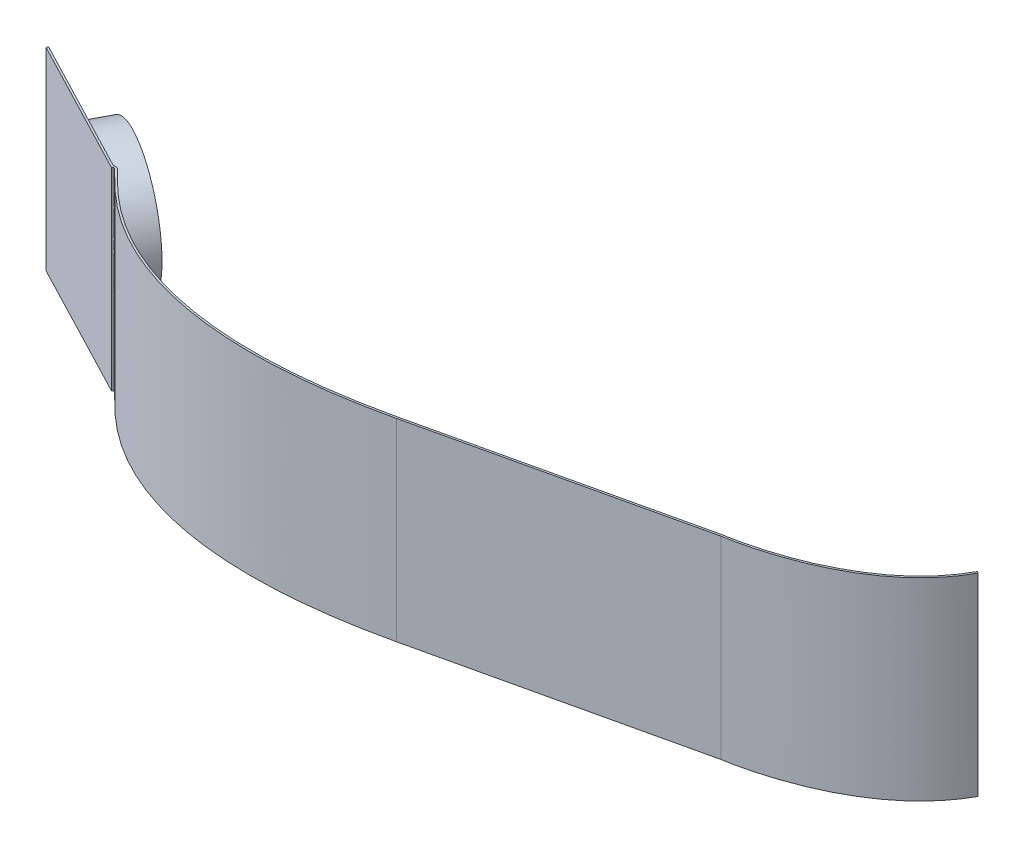
ISO-10303-21;
HEADER;
FILE_DESCRIPTION(('STEP AP214'),'2;1');
FILE_NAME('part.step','',(''),(''),'','','');
FILE_SCHEMA(('AUTOMOTIVE_DESIGN { 1 0 10303 214 1 1 1 1 }'));
ENDSEC;
DATA;
#1=APPLICATION_CONTEXT('core data for automotive mechanical design processes');
#2=APPLICATION_PROTOCOL_DEFINITION('international standard','automotive_design',2000,#1);
#3=PRODUCT_CONTEXT('',#1,'mechanical');
#4=PRODUCT('Part','Part','',(#3));
#5=PRODUCT_RELATED_PRODUCT_CATEGORY('part','',(#4));
#6=PRODUCT_DEFINITION_FORMATION('','',#4);
#7=PRODUCT_DEFINITION_CONTEXT('part definition',#1,'design');
#8=PRODUCT_DEFINITION('design','',#6,#7);
#9=PRODUCT_DEFINITION_SHAPE('','',#8);
#10=(LENGTH_UNIT() NAMED_UNIT(*) SI_UNIT(.MILLI.,.METRE.));
#11=(NAMED_UNIT(*) PLANE_ANGLE_UNIT() SI_UNIT($,.RADIAN.));
#12=(NAMED_UNIT(*) SI_UNIT($,.STERADIAN.) SOLID_ANGLE_UNIT());
#13=UNCERTAINTY_MEASURE_WITH_UNIT(LENGTH_MEASURE(1.E-05),#10,'distance_accuracy_value','');
#14=(GEOMETRIC_REPRESENTATION_CONTEXT(3) GLOBAL_UNCERTAINTY_ASSIGNED_CONTEXT((#13)) GLOBAL_UNIT_ASSIGNED_CONTEXT((#10,
#11,#12)) REPRESENTATION_CONTEXT('',''));
#15=CARTESIAN_POINT('',(0.,0.,0.));
#16=DIRECTION('',(0.,0.,1.));
#17=DIRECTION('',(1.,0.,0.));
#18=AXIS2_PLACEMENT_3D('',#15,#16,#17);
#19=CARTESIAN_POINT('',(-8.29560457956235,10.,4.98998225765585));
#20=CARTESIAN_POINT('',(-8.29545713337748,10.,4.98984712948497));
#21=CARTESIAN_POINT('',(-8.29530968719261,10.,4.98971200131408));
#22=CARTESIAN_POINT('',(-8.29516224100774,10.,4.98957687314319));
#23=CARTESIAN_POINT('',(-8.29161470599449,10.,4.98632570785932));
#24=CARTESIAN_POINT('',(-2.23861903735686,10.,4.15012337809756));
#25=CARTESIAN_POINT('',(0.,10.,0.));
#26=B_SPLINE_CURVE_WITH_KNOTS('',3,(#19,#20,#21,#22,#23,#24,#25),.UNSPECIFIED.,.F.,.F.,(4,3,4),
(-0.0410531683816529,0.000489483582096055,1.),.UNSPECIFIED.);
#27=DIRECTION('',(0.,-1.,0.));
#28=VECTOR('',#27,1.);
#29=SURFACE_OF_LINEAR_EXTRUSION('',#26,#28);
#30=CARTESIAN_POINT('',(-8.29516309928327,0.,4.9895810506514));
#31=CARTESIAN_POINT('',(-8.29754420674234,0.,4.98714392860338));
#32=CARTESIAN_POINT('',(-2.23971534124497,0.,4.15215579018716));
#33=CARTESIAN_POINT('',(0.,0.,0.));
#34=B_SPLINE_CURVE_WITH_KNOTS('',3,(#30,#31,#32,#33),.UNSPECIFIED.,.F.,.F.,(4,4),(0.,1.),.UNSPECIFIED.);
#35=CARTESIAN_POINT('',(-8.29516309928328,0.,4.9895810506514));
#36=VERTEX_POINT('',#35);
#37=CARTESIAN_POINT('',(0.,0.,0.));
#38=VERTEX_POINT('',#37);
#39=EDGE_CURVE('E219',#36,#38,#34,.T.);
#40=ORIENTED_EDGE('',*,*,#39,.T.);
#41=DIRECTION('',(0.,-1.,0.));
#42=VECTOR('',#41,1.);
#43=CARTESIAN_POINT('',(0.,10.,0.));
#44=LINE('',#43,#42);
#45=CARTESIAN_POINT('',(0.,10.,0.));
#46=VERTEX_POINT('',#45);
#47=EDGE_CURVE('E44',#46,#38,#44,.T.);
#48=ORIENTED_EDGE('',*,*,#47,.F.);
#49=CARTESIAN_POINT('',(-8.29516309928327,10.,4.9895810506514));
#50=CARTESIAN_POINT('',(-8.29754420674234,10.,4.98714392860338));
#51=CARTESIAN_POINT('',(-2.23971534124497,10.,4.15215579018716));
#52=CARTESIAN_POINT('',(0.,10.,0.));
#53=B_SPLINE_CURVE_WITH_KNOTS('',3,(#49,#50,#51,#52),.UNSPECIFIED.,.F.,.F.,(4,4),(0.,1.),.UNSPECIFIED.);
#54=CARTESIAN_POINT('',(-8.29516309928328,10.,4.9895810506514));
#55=VERTEX_POINT('',#54);
#56=EDGE_CURVE('E256',#55,#46,#53,.T.);
#57=ORIENTED_EDGE('',*,*,#56,.F.);
#58=DIRECTION('',(0.,-1.,0.));
#59=VECTOR('',#58,1.);
#60=CARTESIAN_POINT('',(-8.29516309928328,10.,4.9895810506514));
#61=LINE('',#60,#59);
#62=EDGE_CURVE('E141',#55,#36,#61,.T.);
#63=ORIENTED_EDGE('',*,*,#62,.T.);
#64=EDGE_LOOP('',(#40,#48,#57,#63));
#65=FACE_BOUND('',#64,.T.);
#66=ADVANCED_FACE('F35',(#65),#29,.F.);
#67=CARTESIAN_POINT('',(-0.0880122318935632,10.,-0.0474746989154609));
#68=DIRECTION('',(-0.474746989154609,0.,0.880122318935631));
#69=DIRECTION('',(0.880122318935631,0.,0.474746989154609));
#70=AXIS2_PLACEMENT_3D('',#67,#68,#69);
#71=PLANE('',#70);
#72=DIRECTION('',(-0.880122318935631,0.,-0.474746989154609));
#73=VECTOR('',#72,1.);
#74=CARTESIAN_POINT('',(-0.0880122318935632,0.,-0.0474746989154609));
#75=LINE('',#74,#73);
#76=CARTESIAN_POINT('',(-0.0880122318935632,0.,-0.0474746989154609));
#77=VERTEX_POINT('',#76);
#78=EDGE_CURVE('E215',#38,#77,#75,.T.);
#79=ORIENTED_EDGE('',*,*,#78,.T.);
#80=DIRECTION('',(0.,-1.,0.));
#81=VECTOR('',#80,1.);
#82=CARTESIAN_POINT('',(-0.0880122318935632,10.,-0.0474746989154609));
#83=LINE('',#82,#81);
#84=CARTESIAN_POINT('',(-0.0880122318935632,10.,-0.0474746989154609));
#85=VERTEX_POINT('',#84);
#86=EDGE_CURVE('E210',#85,#77,#83,.T.);
#87=ORIENTED_EDGE('',*,*,#86,.F.);
#88=DIRECTION('',(-0.880122318935631,0.,-0.474746989154609));
#89=VECTOR('',#88,1.);
#90=CARTESIAN_POINT('',(-0.0880122318935632,10.,-0.0474746989154609));
#91=LINE('',#90,#89);
#92=EDGE_CURVE('E102',#46,#85,#91,.T.);
#93=ORIENTED_EDGE('',*,*,#92,.F.);
#94=ORIENTED_EDGE('',*,*,#47,.T.);
#95=EDGE_LOOP('',(#79,#87,#93,#94));
#96=FACE_BOUND('',#95,.T.);
#97=ADVANCED_FACE('F214',(#96),#71,.F.);
#98=CARTESIAN_POINT('',(-0.0880122318935632,10.,-0.0474746989154609));
#99=CARTESIAN_POINT('',(-0.356397834565828,10.,0.450079081074757));
#100=CARTESIAN_POINT('',(-1.03283663303774,10.,1.38624218729705));
#101=CARTESIAN_POINT('',(-2.68336884966768,10.,2.85063794366895));
#102=CARTESIAN_POINT('',(-4.59765429097134,10.,3.83453828555857));
#103=CARTESIAN_POINT('',(-6.30837125209972,10.,4.43025386776187));
#104=CARTESIAN_POINT('',(-7.19732072237326,10.,4.66653576234868));
#105=CARTESIAN_POINT('',(-7.74428181641744,10.,4.78808191366238));
#106=CARTESIAN_POINT('',(-8.05390587119673,10.,4.84821590861223));
#107=CARTESIAN_POINT('',(-8.26562356691469,10.,4.88466973219331));
#108=CARTESIAN_POINT('',(-8.2895299353271,10.,4.8861388861817));
#109=CARTESIAN_POINT('',(-8.31576816498306,10.,4.89171231489404));
#110=B_SPLINE_CURVE_WITH_KNOTS('',3,(#98,#99,#100,#101,#102,#103,#104,#105,#106,#107,#108,#109),
.UNSPECIFIED.,.F.,.F.,(4,1,1,1,1,1,1,1,1,4),(0.,0.124588700608126,0.249177401216251,
0.498354802432503,0.622943503040628,0.747532203648754,0.809826553952817,0.87212090425688,
0.934415254560942,0.996709604865005),.UNSPECIFIED.);
#111=DIRECTION('',(0.,-1.,0.));
#112=VECTOR('',#111,1.);
#113=SURFACE_OF_LINEAR_EXTRUSION('',#110,#112);
#114=CARTESIAN_POINT('',(-0.0880122318935632,0.,-0.0474746989154609));
#115=CARTESIAN_POINT('',(-0.356397834565828,0.,0.450079081074757));
#116=CARTESIAN_POINT('',(-1.03283663303774,0.,1.38624218729705));
#117=CARTESIAN_POINT('',(-2.68336884966768,0.,2.85063794366895));
#118=CARTESIAN_POINT('',(-4.59765429097134,0.,3.83453828555857));
#119=CARTESIAN_POINT('',(-6.30837125209972,0.,4.43025386776187));
#120=CARTESIAN_POINT('',(-7.19732072237326,0.,4.66653576234868));
#121=CARTESIAN_POINT('',(-7.74428181641744,0.,4.78808191366238));
#122=CARTESIAN_POINT('',(-8.05390587119673,0.,4.84821590861223));
#123=CARTESIAN_POINT('',(-8.26562356691469,0.,4.88466973219331));
#124=CARTESIAN_POINT('',(-8.2895299353271,0.,4.8861388861817));
#125=CARTESIAN_POINT('',(-8.31576816498306,0.,4.89171231489404));
#126=B_SPLINE_CURVE_WITH_KNOTS('',3,(#114,#115,#116,#117,#118,#119,#120,#121,#122,#123,#124,
#125),.UNSPECIFIED.,.F.,.F.,(4,1,1,1,1,1,1,1,1,4),(0.,0.124588700608126,0.249177401216251,
0.498354802432503,0.622943503040628,0.747532203648754,0.809826553952817,0.87212090425688,
0.934415254560942,0.996709604865005),.UNSPECIFIED.);
#127=CARTESIAN_POINT('',(-8.31576816498306,0.,4.89171231489404));
#128=VERTEX_POINT('',#127);
#129=EDGE_CURVE('E222',#77,#128,#126,.T.);
#130=ORIENTED_EDGE('',*,*,#129,.T.);
#131=DIRECTION('',(0.,-1.,0.));
#132=VECTOR('',#131,1.);
#133=CARTESIAN_POINT('',(-8.31576816498306,10.,4.89171231489404));
#134=LINE('',#133,#132);
#135=CARTESIAN_POINT('',(-8.31576816498306,10.,4.89171231489404));
#136=VERTEX_POINT('',#135);
#137=EDGE_CURVE('E207',#136,#128,#134,.T.);
#138=ORIENTED_EDGE('',*,*,#137,.F.);
#139=EDGE_CURVE('E275',#85,#136,#110,.T.);
#140=ORIENTED_EDGE('',*,*,#139,.F.);
#141=ORIENTED_EDGE('',*,*,#86,.T.);
#142=EDGE_LOOP('',(#130,#138,#140,#141));
#143=FACE_BOUND('',#142,.T.);
#144=ADVANCED_FACE('F274',(#143),#113,.F.);
#145=CARTESIAN_POINT('',(-8.31576816498306,10.,4.89171231489404));
#146=DIRECTION('',(0.222533797801789,0.,0.97492497600375));
#147=DIRECTION('',(0.97492497600375,0.,-0.222533797801789));
#148=AXIS2_PLACEMENT_3D('',#145,#146,#147);
#149=PLANE('',#148);
#150=DIRECTION('',(-0.97492497600375,0.,0.222533797801789));
#151=VECTOR('',#150,1.);
#152=CARTESIAN_POINT('',(-8.31576816498306,0.,4.89171231489404));
#153=LINE('',#152,#151);
#154=CARTESIAN_POINT('',(-21.9663661468712,0.,8.00756172479092));
#155=VERTEX_POINT('',#154);
#156=EDGE_CURVE('E235',#128,#155,#153,.T.);
#157=ORIENTED_EDGE('',*,*,#156,.T.);
#158=DIRECTION('',(0.,-1.,0.));
#159=VECTOR('',#158,1.);
#160=CARTESIAN_POINT('',(-21.9663661468712,10.,8.00756172479092));
#161=LINE('',#160,#159);
#162=CARTESIAN_POINT('',(-21.9663661468712,10.,8.00756172479092));
#163=VERTEX_POINT('',#162);
#164=EDGE_CURVE('E204',#163,#155,#161,.T.);
#165=ORIENTED_EDGE('',*,*,#164,.F.);
#166=DIRECTION('',(-0.97492497600375,0.,0.222533797801789));
#167=VECTOR('',#166,1.);
#168=CARTESIAN_POINT('',(-8.31576816498306,10.,4.89171231489404));
#169=LINE('',#168,#167);
#170=EDGE_CURVE('E181',#136,#163,#169,.T.);
#171=ORIENTED_EDGE('',*,*,#170,.F.);
#172=ORIENTED_EDGE('',*,*,#137,.T.);
#173=EDGE_LOOP('',(#157,#165,#171,#172));
#174=FACE_BOUND('',#173,.T.);
#175=ADVANCED_FACE('F171',(#174),#149,.F.);
#176=CARTESIAN_POINT('',(-21.9663661468712,10.,8.00756172479092));
#177=CARTESIAN_POINT('',(-22.3960669978813,10.,8.10564410517753));
#178=CARTESIAN_POINT('',(-23.2752860644075,10.,8.29008635546012));
#179=CARTESIAN_POINT('',(-24.9149877928151,10.,8.57102420603637));
#180=CARTESIAN_POINT('',(-26.8367626846677,10.,8.78669269595092));
#181=CARTESIAN_POINT('',(-28.918808138399,10.,8.84906727757258));
#182=CARTESIAN_POINT('',(-31.4188160982728,10.,8.70858396765882));
#183=CARTESIAN_POINT('',(-34.0450772693976,10.,8.17987224980425));
#184=CARTESIAN_POINT('',(-36.4759145146865,10.,7.19521464773917));
#185=CARTESIAN_POINT('',(-38.2616059932859,10.,6.07352318362928));
#186=CARTESIAN_POINT('',(-39.2738773773643,10.,5.20122166650229));
#187=CARTESIAN_POINT('',(-39.837186402227,10.,4.64714178955607));
#188=CARTESIAN_POINT('',(-40.1432194738164,10.,4.32666542768816));
#189=CARTESIAN_POINT('',(-40.3232214156233,10.,4.16584933741384));
#190=CARTESIAN_POINT('',(-40.4156988848526,10.,4.08647725185921));
#191=CARTESIAN_POINT('',(-40.5362379636096,10.,4.08697907608015));
#192=CARTESIAN_POINT('',(-40.572148999079,10.,4.11641598314651));
#193=B_SPLINE_CURVE_WITH_KNOTS('',3,(#176,#177,#178,#179,#180,#181,#182,#183,#184,#185,#186,
#187,#188,#189,#190,#191,#192),.UNSPECIFIED.,.F.,.F.,(4,1,1,1,1,1,1,1,1,1,1,1,1,1,4),(0.,
0.0301794897446242,0.0603589794892484,0.120717958978497,0.181076938467745,0.241435917956994,
0.36215387693549,0.482871835913987,0.603589794892484,0.724307753870981,0.784666733360229,
0.845025712849478,0.905384692338726,0.93556418208335,0.965743671827974),.UNSPECIFIED.);
#194=DIRECTION('',(0.,-1.,0.));
#195=VECTOR('',#194,1.);
#196=SURFACE_OF_LINEAR_EXTRUSION('',#193,#195);
#197=CARTESIAN_POINT('',(-21.9663661468712,0.,8.00756172479092));
#198=CARTESIAN_POINT('',(-22.3960669978813,0.,8.10564410517753));
#199=CARTESIAN_POINT('',(-23.2752860644075,0.,8.29008635546012));
#200=CARTESIAN_POINT('',(-24.9149877928151,0.,8.57102420603637));
#201=CARTESIAN_POINT('',(-26.8367626846677,0.,8.78669269595092));
#202=CARTESIAN_POINT('',(-28.918808138399,0.,8.84906727757258));
#203=CARTESIAN_POINT('',(-31.4188160982728,0.,8.70858396765882));
#204=CARTESIAN_POINT('',(-34.0450772693976,0.,8.17987224980425));
#205=CARTESIAN_POINT('',(-36.4759145146865,0.,7.19521464773917));
#206=CARTESIAN_POINT('',(-38.2616059932859,0.,6.07352318362928));
#207=CARTESIAN_POINT('',(-39.2738773773643,0.,5.20122166650229));
#208=CARTESIAN_POINT('',(-39.837186402227,0.,4.64714178955607));
#209=CARTESIAN_POINT('',(-40.1432194738164,0.,4.32666542768816));
#210=CARTESIAN_POINT('',(-40.3232214156233,0.,4.16584933741384));
#211=CARTESIAN_POINT('',(-40.4156988848526,0.,4.08647725185921));
#212=CARTESIAN_POINT('',(-40.5362379636096,0.,4.08697907608015));
#213=CARTESIAN_POINT('',(-40.572148999079,0.,4.11641598314651));
#214=B_SPLINE_CURVE_WITH_KNOTS('',3,(#197,#198,#199,#200,#201,#202,#203,#204,#205,#206,#207,
#208,#209,#210,#211,#212,#213),.UNSPECIFIED.,.F.,.F.,(4,1,1,1,1,1,1,1,1,1,1,1,1,1,4),(0.,
0.0301794897446242,0.0603589794892484,0.120717958978497,0.181076938467745,0.241435917956994,
0.36215387693549,0.482871835913987,0.603589794892484,0.724307753870981,0.784666733360229,
0.845025712849478,0.905384692338726,0.93556418208335,0.965743671827974),.UNSPECIFIED.);
#215=CARTESIAN_POINT('',(-40.572148999079,0.,4.11641598314651));
#216=VERTEX_POINT('',#215);
#217=EDGE_CURVE('E240',#155,#216,#214,.T.);
#218=ORIENTED_EDGE('',*,*,#217,.T.);
#219=DIRECTION('',(0.,-1.,0.));
#220=VECTOR('',#219,1.);
#221=CARTESIAN_POINT('',(-40.572148999079,10.,4.11641598314651));
#222=LINE('',#221,#220);
#223=CARTESIAN_POINT('',(-40.572148999079,10.,4.11641598314651));
#224=VERTEX_POINT('',#223);
#225=EDGE_CURVE('E197',#224,#216,#222,.T.);
#226=ORIENTED_EDGE('',*,*,#225,.F.);
#227=EDGE_CURVE('E174',#163,#224,#193,.T.);
#228=ORIENTED_EDGE('',*,*,#227,.F.);
#229=ORIENTED_EDGE('',*,*,#164,.T.);
#230=EDGE_LOOP('',(#218,#226,#228,#229));
#231=FACE_BOUND('',#230,.T.);
#232=ADVANCED_FACE('F166',(#231),#196,.F.);
#233=CARTESIAN_POINT('',(-40.572148999079,10.,4.11641598314651));
#234=DIRECTION('',(-0.462246713202128,0.,0.886751360942756));
#235=DIRECTION('',(0.886751360942756,0.,0.462246713202128));
#236=AXIS2_PLACEMENT_3D('',#233,#234,#235);
#237=PLANE('',#236);
#238=CARTESIAN_POINT('',(-44.074518326861,5.,2.29069709339377));
#239=DIRECTION('',(-0.462246713202128,0.,0.886751360942756));
#240=DIRECTION('',(0.886751360942756,0.,0.462246713202128));
#241=AXIS2_PLACEMENT_3D('',#238,#239,#240);
#242=CIRCLE('',#241,3.49999999999999);
#243=CARTESIAN_POINT('',(-40.9708885635613,5.,3.90856058960121));
#244=VERTEX_POINT('',#243);
#245=EDGE_CURVE('E11',#244,#244,#242,.F.);
#246=ORIENTED_EDGE('',*,*,#245,.F.);
#247=EDGE_LOOP('',(#246));
#248=FACE_BOUND('',#247,.T.);
#249=DIRECTION('',(-0.886751360942756,0.,-0.462246713202128));
#250=VECTOR('',#249,1.);
#251=CARTESIAN_POINT('',(-40.572148999079,0.,4.11641598314651));
#252=LINE('',#251,#250);
#253=CARTESIAN_POINT('',(-47.5768876546429,0.,0.464978203641024));
#254=VERTEX_POINT('',#253);
#255=EDGE_CURVE('E195',#216,#254,#252,.T.);
#256=ORIENTED_EDGE('',*,*,#255,.T.);
#257=DIRECTION('',(0.,-1.,0.));
#258=VECTOR('',#257,1.);
#259=CARTESIAN_POINT('',(-47.5768876546429,10.,0.464978203641024));
#260=LINE('',#259,#258);
#261=CARTESIAN_POINT('',(-47.5768876546429,10.,0.464978203641024));
#262=VERTEX_POINT('',#261);
#263=EDGE_CURVE('E193',#262,#254,#260,.T.);
#264=ORIENTED_EDGE('',*,*,#263,.F.);
#265=DIRECTION('',(-0.886751360942756,0.,-0.462246713202128));
#266=VECTOR('',#265,1.);
#267=CARTESIAN_POINT('',(-40.572148999079,10.,4.11641598314651));
#268=LINE('',#267,#266);
#269=EDGE_CURVE('E180',#224,#262,#268,.T.);
#270=ORIENTED_EDGE('',*,*,#269,.F.);
#271=ORIENTED_EDGE('',*,*,#225,.T.);
#272=EDGE_LOOP('',(#256,#264,#270,#271));
#273=FACE_BOUND('',#272,.T.);
#274=ADVANCED_FACE('F162',(#248,#273),#237,.F.);
#275=CARTESIAN_POINT('',(-47.5768876546429,10.,0.464978203641024));
#276=DIRECTION('',(0.886751360942765,0.,0.46224671320211));
#277=DIRECTION('',(0.46224671320211,0.,-0.886751360942765));
#278=AXIS2_PLACEMENT_3D('',#275,#276,#277);
#279=PLANE('',#278);
#280=DIRECTION('',(-0.46224671320211,0.,0.886751360942765));
#281=VECTOR('',#280,1.);
#282=CARTESIAN_POINT('',(-47.5768876546429,0.,0.464978203641024));
#283=LINE('',#282,#281);
#284=CARTESIAN_POINT('',(-47.6231123259631,0.,0.553653339735303));
#285=VERTEX_POINT('',#284);
#286=EDGE_CURVE('E199',#254,#285,#283,.T.);
#287=ORIENTED_EDGE('',*,*,#286,.T.);
#288=DIRECTION('',(0.,-1.,0.));
#289=VECTOR('',#288,1.);
#290=CARTESIAN_POINT('',(-47.6231123259631,10.,0.553653339735303));
#291=LINE('',#290,#289);
#292=CARTESIAN_POINT('',(-47.6231123259631,10.,0.553653339735303));
#293=VERTEX_POINT('',#292);
#294=EDGE_CURVE('E136',#293,#285,#291,.T.);
#295=ORIENTED_EDGE('',*,*,#294,.F.);
#296=DIRECTION('',(-0.46224671320211,0.,0.886751360942765));
#297=VECTOR('',#296,1.);
#298=CARTESIAN_POINT('',(-47.5768876546429,10.,0.464978203641024));
#299=LINE('',#298,#297);
#300=EDGE_CURVE('E127',#262,#293,#299,.T.);
#301=ORIENTED_EDGE('',*,*,#300,.F.);
#302=ORIENTED_EDGE('',*,*,#263,.T.);
#303=EDGE_LOOP('',(#287,#295,#301,#302));
#304=FACE_BOUND('',#303,.T.);
#305=ADVANCED_FACE('F159',(#304),#279,.F.);
#306=CARTESIAN_POINT('',(-40.5291014384211,10.,4.25162704535232));
#307=DIRECTION('',(0.462246713202127,0.,-0.886751360942756));
#308=DIRECTION('',(-0.886751360942756,0.,-0.462246713202127));
#309=AXIS2_PLACEMENT_3D('',#306,#307,#308);
#310=PLANE('',#309);
#311=DIRECTION('',(0.886751360942756,0.,0.462246713202127));
#312=VECTOR('',#311,1.);
#313=CARTESIAN_POINT('',(-40.5291014384211,0.,4.25162704535232));
#314=LINE('',#313,#312);
#315=CARTESIAN_POINT('',(-40.5291014384211,0.,4.25162704535232));
#316=VERTEX_POINT('',#315);
#317=EDGE_CURVE('E135',#285,#316,#314,.T.);
#318=ORIENTED_EDGE('',*,*,#317,.T.);
#319=DIRECTION('',(0.,-1.,0.));
#320=VECTOR('',#319,1.);
#321=CARTESIAN_POINT('',(-40.5291014384211,10.,4.25162704535232));
#322=LINE('',#321,#320);
#323=CARTESIAN_POINT('',(-40.5291014384211,10.,4.25162704535232));
#324=VERTEX_POINT('',#323);
#325=EDGE_CURVE('E132',#324,#316,#322,.T.);
#326=ORIENTED_EDGE('',*,*,#325,.F.);
#327=DIRECTION('',(0.886751360942756,0.,0.462246713202127));
#328=VECTOR('',#327,1.);
#329=CARTESIAN_POINT('',(-40.5291014384211,10.,4.25162704535232));
#330=LINE('',#329,#328);
#331=EDGE_CURVE('E121',#293,#324,#330,.T.);
#332=ORIENTED_EDGE('',*,*,#331,.F.);
#333=ORIENTED_EDGE('',*,*,#294,.T.);
#334=EDGE_LOOP('',(#318,#326,#332,#333));
#335=FACE_BOUND('',#334,.T.);
#336=ADVANCED_FACE('F133',(#335),#310,.F.);
#337=CARTESIAN_POINT('',(-40.5291014384211,10.,4.25162704535233));
#338=CARTESIAN_POINT('',(-40.4640021809731,10.,3.39086402880593));
#339=CARTESIAN_POINT('',(-36.5993986089261,10.,11.4502310290803));
#340=CARTESIAN_POINT('',(-21.9441127670798,10.,8.10505422238872));
#341=B_SPLINE_CURVE_WITH_KNOTS('',3,(#337,#338,#339,#340),.UNSPECIFIED.,.F.,.F.,(4,4),(0.,1.),.UNSPECIFIED.);
#342=DIRECTION('',(0.,-1.,0.));
#343=VECTOR('',#342,1.);
#344=SURFACE_OF_LINEAR_EXTRUSION('',#341,#343);
#345=CARTESIAN_POINT('',(-40.5291014384211,0.,4.25162704535233));
#346=CARTESIAN_POINT('',(-40.4640021809731,0.,3.39086402880593));
#347=CARTESIAN_POINT('',(-36.5993986089261,0.,11.4502310290803));
#348=CARTESIAN_POINT('',(-21.9441127670798,0.,8.10505422238872));
#349=B_SPLINE_CURVE_WITH_KNOTS('',3,(#345,#346,#347,#348),.UNSPECIFIED.,.F.,.F.,(4,4),(0.,1.),.UNSPECIFIED.);
#350=CARTESIAN_POINT('',(-21.9441127670798,0.,8.10505422238872));
#351=VERTEX_POINT('',#350);
#352=EDGE_CURVE('E87',#316,#351,#349,.T.);
#353=ORIENTED_EDGE('',*,*,#352,.T.);
#354=DIRECTION('',(0.,-1.,0.));
#355=VECTOR('',#354,1.);
#356=CARTESIAN_POINT('',(-21.9441127670798,10.,8.10505422238872));
#357=LINE('',#356,#355);
#358=CARTESIAN_POINT('',(-21.9441127670798,10.,8.10505422238872));
#359=VERTEX_POINT('',#358);
#360=EDGE_CURVE('E137',#359,#351,#357,.T.);
#361=ORIENTED_EDGE('',*,*,#360,.F.);
#362=EDGE_CURVE('E125',#324,#359,#341,.T.);
#363=ORIENTED_EDGE('',*,*,#362,.F.);
#364=ORIENTED_EDGE('',*,*,#325,.T.);
#365=EDGE_LOOP('',(#353,#361,#363,#364));
#366=FACE_BOUND('',#365,.T.);
#367=ADVANCED_FACE('F139',(#366),#344,.F.);
#368=CARTESIAN_POINT('',(-8.29516309928328,10.,4.9895810506514));
#369=DIRECTION('',(-0.22253379791433,0.,-0.974924975978061));
#370=DIRECTION('',(-0.974924975978062,0.,0.22253379791433));
#371=AXIS2_PLACEMENT_3D('',#368,#369,#370);
#372=PLANE('',#371);
#373=DIRECTION('',(0.974924975978061,0.,-0.22253379791433));
#374=VECTOR('',#373,1.);
#375=CARTESIAN_POINT('',(-8.29516309928328,0.,4.9895810506514));
#376=LINE('',#375,#374);
#377=EDGE_CURVE('E93',#351,#36,#376,.T.);
#378=ORIENTED_EDGE('',*,*,#377,.T.);
#379=ORIENTED_EDGE('',*,*,#62,.F.);
#380=DIRECTION('',(0.974924975978061,0.,-0.22253379791433));
#381=VECTOR('',#380,1.);
#382=CARTESIAN_POINT('',(-8.29516309928328,10.,4.9895810506514));
#383=LINE('',#382,#381);
#384=EDGE_CURVE('E52',#359,#55,#383,.T.);
#385=ORIENTED_EDGE('',*,*,#384,.F.);
#386=ORIENTED_EDGE('',*,*,#360,.T.);
#387=EDGE_LOOP('',(#378,#379,#385,#386));
#388=FACE_BOUND('',#387,.T.);
#389=ADVANCED_FACE('F155',(#388),#372,.F.);
#390=CARTESIAN_POINT('',(-4.98836771790565,10.,4.05093502587788));
#391=DIRECTION('',(0.,1.,0.));
#392=DIRECTION('',(0.,0.,1.));
#393=AXIS2_PLACEMENT_3D('',#390,#391,#392);
#394=PLANE('',#393);
#395=ORIENTED_EDGE('',*,*,#56,.T.);
#396=ORIENTED_EDGE('',*,*,#92,.T.);
#397=ORIENTED_EDGE('',*,*,#139,.T.);
#398=ORIENTED_EDGE('',*,*,#170,.T.);
#399=ORIENTED_EDGE('',*,*,#227,.T.);
#400=ORIENTED_EDGE('',*,*,#269,.T.);
#401=ORIENTED_EDGE('',*,*,#300,.T.);
#402=ORIENTED_EDGE('',*,*,#331,.T.);
#403=ORIENTED_EDGE('',*,*,#362,.T.);
#404=ORIENTED_EDGE('',*,*,#384,.T.);
#405=EDGE_LOOP('',(#395,#396,#397,#398,#399,#400,#401,#402,#403,#404));
#406=FACE_BOUND('',#405,.T.);
#407=ADVANCED_FACE('F123',(#406),#394,.T.);
#408=CARTESIAN_POINT('',(-4.98836771790565,0.,4.05093502587788));
#409=DIRECTION('',(0.,1.,0.));
#410=DIRECTION('',(0.,0.,1.));
#411=AXIS2_PLACEMENT_3D('',#408,#409,#410);
#412=PLANE('',#411);
#413=ORIENTED_EDGE('',*,*,#39,.F.);
#414=ORIENTED_EDGE('',*,*,#377,.F.);
#415=ORIENTED_EDGE('',*,*,#352,.F.);
#416=ORIENTED_EDGE('',*,*,#317,.F.);
#417=ORIENTED_EDGE('',*,*,#286,.F.);
#418=ORIENTED_EDGE('',*,*,#255,.F.);
#419=ORIENTED_EDGE('',*,*,#217,.F.);
#420=ORIENTED_EDGE('',*,*,#156,.F.);
#421=ORIENTED_EDGE('',*,*,#129,.F.);
#422=ORIENTED_EDGE('',*,*,#78,.F.);
#423=EDGE_LOOP('',(#413,#414,#415,#416,#417,#418,#419,#420,#421,#422));
#424=FACE_BOUND('',#423,.T.);
#425=ADVANCED_FACE('F264',(#424),#412,.F.);
#426=CARTESIAN_POINT('',(-43.1500249004567,5.,0.517194371508268));
#427=DIRECTION('',(-0.462246713202128,0.,0.886751360942756));
#428=DIRECTION('',(0.886751360942756,0.,0.462246713202128));
#429=AXIS2_PLACEMENT_3D('',#426,#427,#428);
#430=CYLINDRICAL_SURFACE('',#429,3.49999999999999);
#431=CARTESIAN_POINT('',(-43.1500249004567,5.,0.517194371508268));
#432=DIRECTION('',(0.462246713202128,0.,-0.886751360942756));
#433=DIRECTION('',(-0.886751360942756,0.,-0.462246713202128));
#434=AXIS2_PLACEMENT_3D('',#431,#432,#433);
#435=CIRCLE('',#434,3.49999999999999);
#436=CARTESIAN_POINT('',(-46.2536546637563,5.,-1.10066912469918));
#437=VERTEX_POINT('',#436);
#438=EDGE_CURVE('E221',#437,#437,#435,.T.);
#439=ORIENTED_EDGE('',*,*,#438,.F.);
#440=EDGE_LOOP('',(#439));
#441=FACE_BOUND('',#440,.T.);
#442=ORIENTED_EDGE('',*,*,#245,.T.);
#443=EDGE_LOOP('',(#442));
#444=FACE_BOUND('',#443,.T.);
#445=ADVANCED_FACE('F327',(#441,#444),#430,.T.);
#446=CARTESIAN_POINT('',(-43.1500249004567,5.,0.517194371508268));
#447=DIRECTION('',(0.462246713202128,0.,-0.886751360942756));
#448=DIRECTION('',(-0.886751360942756,0.,-0.462246713202128));
#449=AXIS2_PLACEMENT_3D('',#446,#447,#448);
#450=PLANE('',#449);
#451=ORIENTED_EDGE('',*,*,#438,.T.);
#452=EDGE_LOOP('',(#451));
#453=FACE_BOUND('',#452,.T.);
#454=ADVANCED_FACE('F322',(#453),#450,.T.);
#455=CLOSED_SHELL('',(#66,#97,#144,#175,#232,#274,#305,#336,#367,#389,#407,#425,#445,#454));
#456=MANIFOLD_SOLID_BREP('B2',#455);
#457=ADVANCED_BREP_SHAPE_REPRESENTATION('',(#18,#456),#14);
#458=SHAPE_DEFINITION_REPRESENTATION(#9,#457);
ENDSEC;
END-ISO-10303-21;
